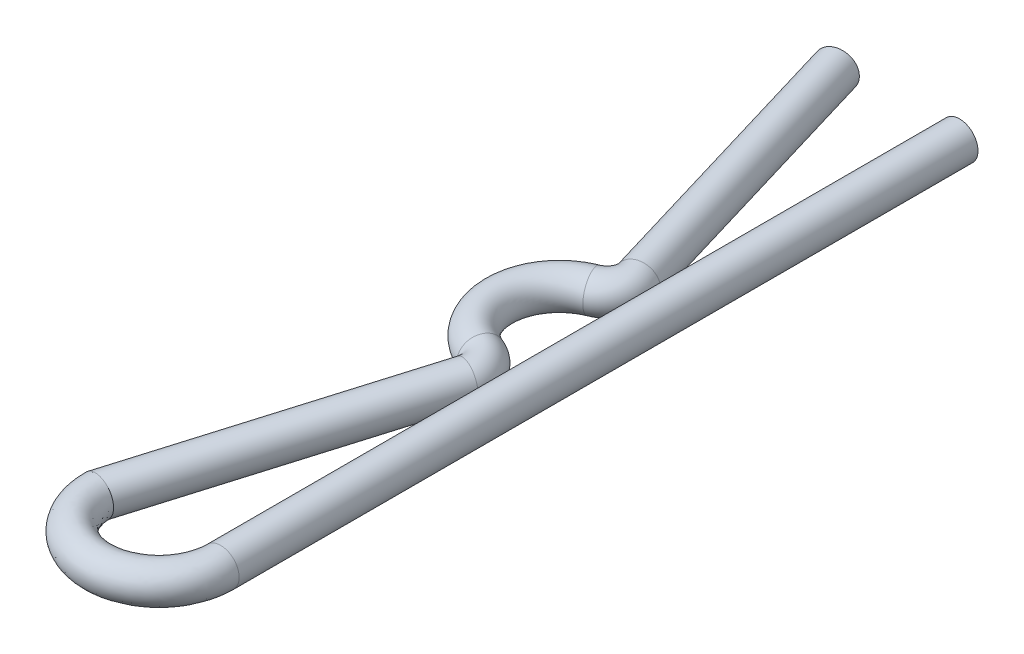
ISO-10303-21;
HEADER;
FILE_DESCRIPTION(('STEP AP214'),'2;1');
FILE_NAME('part.step','',(''),(''),'','','');
FILE_SCHEMA(('AUTOMOTIVE_DESIGN { 1 0 10303 214 1 1 1 1 }'));
ENDSEC;
DATA;
#1=APPLICATION_CONTEXT('core data for automotive mechanical design processes');
#2=APPLICATION_PROTOCOL_DEFINITION('international standard','automotive_design',2000,#1);
#3=PRODUCT_CONTEXT('',#1,'mechanical');
#4=PRODUCT('Part','Part','',(#3));
#5=PRODUCT_RELATED_PRODUCT_CATEGORY('part','',(#4));
#6=PRODUCT_DEFINITION_FORMATION('','',#4);
#7=PRODUCT_DEFINITION_CONTEXT('part definition',#1,'design');
#8=PRODUCT_DEFINITION('design','',#6,#7);
#9=PRODUCT_DEFINITION_SHAPE('','',#8);
#10=(LENGTH_UNIT() NAMED_UNIT(*) SI_UNIT(.MILLI.,.METRE.));
#11=(NAMED_UNIT(*) PLANE_ANGLE_UNIT() SI_UNIT($,.RADIAN.));
#12=(NAMED_UNIT(*) SI_UNIT($,.STERADIAN.) SOLID_ANGLE_UNIT());
#13=UNCERTAINTY_MEASURE_WITH_UNIT(LENGTH_MEASURE(1.E-05),#10,'distance_accuracy_value','');
#14=(GEOMETRIC_REPRESENTATION_CONTEXT(3) GLOBAL_UNCERTAINTY_ASSIGNED_CONTEXT((#13)) GLOBAL_UNIT_ASSIGNED_CONTEXT((#10,
#11,#12)) REPRESENTATION_CONTEXT('',''));
#15=CARTESIAN_POINT('',(0.,0.,0.));
#16=DIRECTION('',(0.,0.,1.));
#17=DIRECTION('',(1.,0.,0.));
#18=AXIS2_PLACEMENT_3D('',#15,#16,#17);
#19=CARTESIAN_POINT('',(-152.5,5.,-200.));
#20=DIRECTION('',(-0.286297081211299,0.,-0.958140898453819));
#21=DIRECTION('',(-0.958140898453819,0.,0.286297081211299));
#22=AXIS2_PLACEMENT_3D('',#19,#20,#21);
#23=PLANE('',#22);
#24=CARTESIAN_POINT('',(-152.5,5.,-200.));
#25=DIRECTION('',(-0.286297081211299,0.,-0.958140898453819));
#26=DIRECTION('',(-0.958140898453819,0.,0.286297081211299));
#27=AXIS2_PLACEMENT_3D('',#24,#25,#26);
#28=CIRCLE('',#27,0.750000000000012);
#29=CARTESIAN_POINT('',(-153.21860567384,5.,-199.785277189091));
#30=VERTEX_POINT('',#29);
#31=EDGE_CURVE('E42',#30,#30,#28,.T.);
#32=ORIENTED_EDGE('',*,*,#31,.T.);
#33=EDGE_LOOP('',(#32));
#34=FACE_BOUND('',#33,.T.);
#35=ADVANCED_FACE('F39',(#34),#23,.T.);
#36=CARTESIAN_POINT('',(-147.5,5.,-200.));
#37=DIRECTION('',(0.,0.,1.));
#38=DIRECTION('',(1.,0.,0.));
#39=AXIS2_PLACEMENT_3D('',#36,#37,#38);
#40=PLANE('',#39);
#41=CARTESIAN_POINT('',(-147.5,5.,-200.));
#42=DIRECTION('',(0.,0.,1.));
#43=DIRECTION('',(1.,0.,0.));
#44=AXIS2_PLACEMENT_3D('',#41,#42,#43);
#45=CIRCLE('',#44,0.750000000000012);
#46=CARTESIAN_POINT('',(-146.75,5.,-200.));
#47=VERTEX_POINT('',#46);
#48=EDGE_CURVE('E62',#47,#47,#45,.T.);
#49=ORIENTED_EDGE('',*,*,#48,.F.);
#50=EDGE_LOOP('',(#49));
#51=FACE_BOUND('',#50,.T.);
#52=ADVANCED_FACE('F87',(#51),#40,.F.);
#53=CARTESIAN_POINT('',(-150.020093319936,5.,-181.792296310652));
#54=DIRECTION('',(0.,1.,0.));
#55=DIRECTION('',(0.,0.,1.));
#56=AXIS2_PLACEMENT_3D('',#53,#54,#55);
#57=TOROIDAL_SURFACE('',#56,1.00000000000004,0.750000000000012);
#58=CARTESIAN_POINT('',(-149.061952421482,5.,-181.505999229441));
#59=DIRECTION('',(0.286297081211301,0.,-0.958140898453818));
#60=DIRECTION('',(-0.958140898453818,0.,-0.286297081211301));
#61=AXIS2_PLACEMENT_3D('',#58,#59,#60);
#62=CIRCLE('',#61,0.750000000000012);
#63=CARTESIAN_POINT('',(-148.343346747641,5.,-181.291276418532));
#64=VERTEX_POINT('',#63);
#65=EDGE_CURVE('E134',#64,#64,#62,.T.);
#66=CARTESIAN_POINT('',(-149.65195032865,5.,-182.72206549597));
#67=DIRECTION('',(-0.929769185318183,0.,-0.368142991285673));
#68=DIRECTION('',(-0.368142991285673,0.,0.929769185318183));
#69=AXIS2_PLACEMENT_3D('',#66,#67,#68);
#70=CIRCLE('',#69,0.750000000000012);
#71=CARTESIAN_POINT('',(-149.375843085186,5.,-183.419392384959));
#72=VERTEX_POINT('',#71);
#73=EDGE_CURVE('E130',#72,#72,#70,.T.);
#74=CARTESIAN_POINT('',(-150.020093319936,5.,-181.792296310652));
#75=DIRECTION('',(0.,1.,0.));
#76=DIRECTION('',(0.,0.,1.));
#77=AXIS2_PLACEMENT_3D('',#74,#75,#76);
#78=CIRCLE('',#77,1.75000000000005);
#79=EDGE_CURVE('',#64,#72,#78,.T.);
#80=ORIENTED_EDGE('',*,*,#65,.T.);
#81=ORIENTED_EDGE('',*,*,#73,.F.);
#82=ORIENTED_EDGE('',*,*,#79,.T.);
#83=ORIENTED_EDGE('',*,*,#79,.F.);
#84=EDGE_LOOP('',(#80,#82,#81,#83));
#85=FACE_BOUND('',#84,.T.);
#86=ADVANCED_FACE('F82',(#85),#57,.T.);
#87=CARTESIAN_POINT('',(-148.75,5.,-185.));
#88=DIRECTION('',(0.,-1.,0.));
#89=DIRECTION('',(0.,0.,-1.));
#90=AXIS2_PLACEMENT_3D('',#87,#88,#89);
#91=TOROIDAL_SURFACE('',#90,2.44999999999997,0.750000000000012);
#92=CARTESIAN_POINT('',(-149.65195032865,5.,-187.27793450403));
#93=DIRECTION('',(0.929769185318179,0.,-0.368142991285682));
#94=DIRECTION('',(-0.368142991285682,0.,-0.929769185318179));
#95=AXIS2_PLACEMENT_3D('',#92,#93,#94);
#96=CIRCLE('',#95,0.750000000000012);
#97=CARTESIAN_POINT('',(-149.375843085186,5.,-186.580607615041));
#98=VERTEX_POINT('',#97);
#99=EDGE_CURVE('E126',#98,#98,#96,.T.);
#100=ORIENTED_EDGE('',*,*,#99,.F.);
#101=EDGE_LOOP('',(#100));
#102=FACE_BOUND('',#101,.T.);
#103=ORIENTED_EDGE('',*,*,#73,.T.);
#104=EDGE_LOOP('',(#103));
#105=FACE_BOUND('',#104,.T.);
#106=ADVANCED_FACE('F86',(#102,#105),#91,.T.);
#107=CARTESIAN_POINT('',(-150.020093319936,5.,-188.207703689348));
#108=DIRECTION('',(0.,1.,0.));
#109=DIRECTION('',(0.,0.,1.));
#110=AXIS2_PLACEMENT_3D('',#107,#108,#109);
#111=TOROIDAL_SURFACE('',#110,0.99999999999999,0.750000000000012);
#112=CARTESIAN_POINT('',(-149.061952421482,5.,-188.494000770559));
#113=DIRECTION('',(-0.286297081211309,0.,-0.958140898453816));
#114=DIRECTION('',(-0.958140898453816,0.,0.286297081211309));
#115=AXIS2_PLACEMENT_3D('',#112,#113,#114);
#116=CIRCLE('',#115,0.750000000000012);
#117=CARTESIAN_POINT('',(-148.343346747641,5.,-188.708723581467));
#118=VERTEX_POINT('',#117);
#119=EDGE_CURVE('E123',#118,#118,#116,.T.);
#120=CARTESIAN_POINT('',(-150.020093319936,5.,-188.207703689348));
#121=DIRECTION('',(0.,1.,0.));
#122=DIRECTION('',(0.,0.,1.));
#123=AXIS2_PLACEMENT_3D('',#120,#121,#122);
#124=CIRCLE('',#123,1.75);
#125=EDGE_CURVE('',#98,#118,#124,.T.);
#126=ORIENTED_EDGE('',*,*,#99,.T.);
#127=ORIENTED_EDGE('',*,*,#119,.F.);
#128=ORIENTED_EDGE('',*,*,#125,.T.);
#129=ORIENTED_EDGE('',*,*,#125,.F.);
#130=EDGE_LOOP('',(#126,#128,#127,#129));
#131=FACE_BOUND('',#130,.T.);
#132=ADVANCED_FACE('F91',(#131),#111,.T.);
#133=CARTESIAN_POINT('',(-149.061952421482,5.,-188.494000770559));
#134=DIRECTION('',(-0.286297081211299,0.,-0.958140898453819));
#135=DIRECTION('',(-0.958140898453819,0.,0.286297081211299));
#136=AXIS2_PLACEMENT_3D('',#133,#134,#135);
#137=CYLINDRICAL_SURFACE('',#136,0.750000000000012);
#138=ORIENTED_EDGE('',*,*,#31,.F.);
#139=EDGE_LOOP('',(#138));
#140=FACE_BOUND('',#139,.T.);
#141=ORIENTED_EDGE('',*,*,#119,.T.);
#142=EDGE_LOOP('',(#141));
#143=FACE_BOUND('',#142,.T.);
#144=ADVANCED_FACE('F95',(#140,#143),#137,.T.);
#145=CARTESIAN_POINT('',(-152.563163466897,5.,-169.788612930786));
#146=DIRECTION('',(0.286297081211301,0.,-0.958140898453818));
#147=DIRECTION('',(-0.958140898453818,0.,-0.286297081211301));
#148=AXIS2_PLACEMENT_3D('',#145,#146,#147);
#149=CYLINDRICAL_SURFACE('',#148,0.750000000000012);
#150=CARTESIAN_POINT('',(-152.5,5.75000000000001,-170.));
#151=CARTESIAN_POINT('',(-152.503375330648,5.75000011260235,-170.000493330124));
#152=CARTESIAN_POINT('',(-152.506751182232,5.7499773120419,-170.00098673835));
#153=CARTESIAN_POINT('',(-152.552521718769,5.7493579131014,-170.007676501503));
#154=CARTESIAN_POINT('',(-152.594943296979,5.74517524825669,-170.013877089442));
#155=CARTESIAN_POINT('',(-152.678569825528,5.72967812627067,-170.026100925214));
#156=CARTESIAN_POINT('',(-152.719771185352,5.71834446165278,-170.032123649557));
#157=CARTESIAN_POINT('',(-152.799666852359,5.6888477693917,-170.043803020842));
#158=CARTESIAN_POINT('',(-152.838363901874,5.67069236544348,-170.049460068208));
#159=CARTESIAN_POINT('',(-152.912169856392,5.62804148290476,-170.060249932538));
#160=CARTESIAN_POINT('',(-152.947278809077,5.60354608858256,-170.065382756468));
#161=CARTESIAN_POINT('',(-153.01271242388,5.54903004852626,-170.074949185807));
#162=CARTESIAN_POINT('',(-153.043060457423,5.51903806834385,-170.07938620688));
#163=CARTESIAN_POINT('',(-153.098285032627,5.45428033072372,-170.087460443309));
#164=CARTESIAN_POINT('',(-153.123161162324,5.41951421417569,-170.091097598447));
#165=CARTESIAN_POINT('',(-153.166460982495,5.34657674917339,-170.09742857765));
#166=CARTESIAN_POINT('',(-153.184947750324,5.30844364777722,-170.10013162344));
#167=CARTESIAN_POINT('',(-153.215256133025,5.22956264771869,-170.104563203915));
#168=CARTESIAN_POINT('',(-153.227078258191,5.18881494951503,-170.10629181321));
#169=CARTESIAN_POINT('',(-153.243618993026,5.10626470060105,-170.108710376375));
#170=CARTESIAN_POINT('',(-153.248402086906,5.06447533815727,-170.109409758938));
#171=CARTESIAN_POINT('',(-153.250925554966,4.98068055323597,-170.109778739158));
#172=CARTESIAN_POINT('',(-153.24866614974,4.93867513756704,-170.109448369072));
#173=CARTESIAN_POINT('',(-153.237198376062,4.85582791680656,-170.107771561805));
#174=CARTESIAN_POINT('',(-153.228019560298,4.8149819275491,-170.106429445776));
#175=CARTESIAN_POINT('',(-153.203023518739,4.73542084718833,-170.102774591182));
#176=CARTESIAN_POINT('',(-153.187206212417,4.69670578194008,-170.100461840842));
#177=CARTESIAN_POINT('',(-153.149353342886,4.62239070520035,-170.094927213689));
#178=CARTESIAN_POINT('',(-153.127301823859,4.58679899797424,-170.091703004091));
#179=CARTESIAN_POINT('',(-153.077646085696,4.51982549761284,-170.084442858151));
#180=CARTESIAN_POINT('',(-153.050042019476,4.48844358857946,-170.080406944163));
#181=CARTESIAN_POINT('',(-152.989503844714,4.43018624832734,-170.071556047467));
#182=CARTESIAN_POINT('',(-152.956478673881,4.40340744520117,-170.066727754999));
#183=CARTESIAN_POINT('',(-152.886448150136,4.35583196489853,-170.056489573118));
#184=CARTESIAN_POINT('',(-152.849442559585,4.33503564516152,-170.05107964898));
#185=CARTESIAN_POINT('',(-152.772490065953,4.29997070160093,-170.0398301875));
#186=CARTESIAN_POINT('',(-152.732540860012,4.2857072529133,-170.033990313801));
#187=CARTESIAN_POINT('',(-152.650915979252,4.2641326437279,-170.022058648033));
#188=CARTESIAN_POINT('',(-152.609244224016,4.25680651823822,-170.015967427941));
#189=CARTESIAN_POINT('',(-152.548283577589,4.25131135329889,-170.007057121793));
#190=CARTESIAN_POINT('',(-152.529209253263,4.25032595275375,-170.004269181337));
#191=CARTESIAN_POINT('',(-152.506751623757,4.25002280954366,-170.000986802892));
#192=CARTESIAN_POINT('',(-152.503375800376,4.2500000201725,-170.000493398785));
#193=CARTESIAN_POINT('',(-152.5,4.24999999999999,-170.));
#194=B_SPLINE_CURVE_WITH_KNOTS('',3,(#150,#151,#152,#153,#154,#155,#156,#157,#158,#159,#160,
#161,#162,#163,#164,#165,#166,#167,#168,#169,#170,#171,#172,#173,#174,#175,#176,#177,#178,#179,
#180,#181,#182,#183,#184,#185,#186,#187,#188,#189,#190,#191,#192,#193),.UNSPECIFIED.,.F.,.F.,(4,
2,2,2,2,2,2,2,2,2,2,2,2,2,2,2,2,2,2,2,2,4),(0.,0.0102350319558408,0.138761754328585,
0.267635175763977,0.396364999878873,0.525093113062595,0.653168064695325,0.781252655402597,
0.908034002040272,1.03480564005793,1.16040853974329,1.286007505205,1.41107305749056,
1.53614012689557,1.66153023619956,1.78691689273537,1.91467876819877,2.04244827555212,
2.17031882359132,2.29791290036853,2.35577118588024,2.36600621783616),.UNSPECIFIED.);
#195=CARTESIAN_POINT('',(-152.5,5.75000000000001,-170.));
#196=VERTEX_POINT('',#195);
#197=CARTESIAN_POINT('',(-152.5,4.24999999999999,-170.));
#198=VERTEX_POINT('',#197);
#199=EDGE_CURVE('E11',#196,#198,#194,.T.);
#200=ORIENTED_EDGE('',*,*,#199,.F.);
#201=CARTESIAN_POINT('',(-152.5,5.75000000000001,-170.));
#202=CARTESIAN_POINT('',(-152.496624668512,5.75000011249518,-169.999506667558));
#203=CARTESIAN_POINT('',(-152.493248744198,5.74997731198361,-169.999013758482));
#204=CARTESIAN_POINT('',(-152.44739213498,5.74935681573075,-169.992325244979));
#205=CARTESIAN_POINT('',(-152.404873115549,5.74515918546722,-169.986203720871));
#206=CARTESIAN_POINT('',(-152.32103537906,5.72961603019825,-169.974282986299));
#207=CARTESIAN_POINT('',(-152.279720231482,5.71825114333282,-169.968484695354));
#208=CARTESIAN_POINT('',(-152.199587235641,5.68868665006071,-169.957381196812));
#209=CARTESIAN_POINT('',(-152.160766432144,5.67049531310356,-169.952075402275));
#210=CARTESIAN_POINT('',(-152.08669945629,5.62777137405202,-169.94208753473));
#211=CARTESIAN_POINT('',(-152.051453262761,5.60323880951929,-169.937405458029));
#212=CARTESIAN_POINT('',(-151.985690264028,5.54860715761486,-169.928791956661));
#213=CARTESIAN_POINT('',(-151.955156585289,5.51852881876622,-169.92485784154));
#214=CARTESIAN_POINT('',(-151.899580594929,5.45357681246055,-169.917796940958));
#215=CARTESIAN_POINT('',(-151.874538701311,5.41870278031227,-169.914670216948));
#216=CARTESIAN_POINT('',(-151.830971834439,5.34555637681782,-169.909298130581));
#217=CARTESIAN_POINT('',(-151.812378365314,5.30732549515586,-169.907043473396));
#218=CARTESIAN_POINT('',(-151.78192070395,5.22823400968775,-169.903383235674));
#219=CARTESIAN_POINT('',(-151.7700557896,5.18737368859893,-169.901977564021));
#220=CARTESIAN_POINT('',(-151.753550150182,5.1047573975312,-169.900029731008));
#221=CARTESIAN_POINT('',(-151.748816787621,5.06302018304611,-169.899476494495));
#222=CARTESIAN_POINT('',(-151.746433132869,4.97934226513357,-169.899197334209));
#223=CARTESIAN_POINT('',(-151.748782470795,4.93740157244661,-169.899471367233));
#224=CARTESIAN_POINT('',(-151.760444563061,4.85482311925906,-169.90084238043));
#225=CARTESIAN_POINT('',(-151.769707222966,4.81417816825361,-169.901933440552));
#226=CARTESIAN_POINT('',(-151.794843958298,4.73501923317368,-169.904931763741));
#227=CARTESIAN_POINT('',(-151.810718249978,4.6965053188481,-169.906839053505));
#228=CARTESIAN_POINT('',(-151.848675844746,4.62250237045656,-169.911471667751));
#229=CARTESIAN_POINT('',(-151.870787103335,4.58702791537399,-169.914200679181));
#230=CARTESIAN_POINT('',(-151.920522934797,4.52026620756039,-169.920443724083));
#231=CARTESIAN_POINT('',(-151.948147262726,4.48897876890474,-169.92395772268));
#232=CARTESIAN_POINT('',(-152.008484552521,4.43105982883765,-169.931760209947));
#233=CARTESIAN_POINT('',(-152.041256322111,4.40449081775721,-169.936057755142));
#234=CARTESIAN_POINT('',(-152.110695949221,4.35719875646855,-169.945304719747));
#235=CARTESIAN_POINT('',(-152.147364098772,4.3364761448689,-169.950254188026));
#236=CARTESIAN_POINT('',(-152.224321680237,4.30107485967638,-169.960788262599));
#237=CARTESIAN_POINT('',(-152.264668604983,4.28652450887457,-169.966383538024));
#238=CARTESIAN_POINT('',(-152.347121430249,4.26449632092791,-169.977971126385));
#239=CARTESIAN_POINT('',(-152.389223358929,4.25700333230107,-169.983962559055));
#240=CARTESIAN_POINT('',(-152.450981451229,4.25134924758042,-169.99286548671));
#241=CARTESIAN_POINT('',(-152.470424271111,4.25033086884783,-169.995684633315));
#242=CARTESIAN_POINT('',(-152.493248307772,4.25002280888505,-169.999013697165));
#243=CARTESIAN_POINT('',(-152.496624204605,4.25000001935859,-169.999506602418));
#244=CARTESIAN_POINT('',(-152.5,4.24999999999999,-170.));
#245=B_SPLINE_CURVE_WITH_KNOTS('',3,(#201,#202,#203,#204,#205,#206,#207,#208,#209,#210,#211,
#212,#213,#214,#215,#216,#217,#218,#219,#220,#221,#222,#223,#224,#225,#226,#227,#228,#229,#230,
#231,#232,#233,#234,#235,#236,#237,#238,#239,#240,#241,#242,#243,#244),.UNSPECIFIED.,.F.,.F.,(4,
2,2,2,2,2,2,2,2,2,2,2,2,2,2,2,2,2,2,2,2,4),(0.,0.0102350320472458,0.139016739192064,
0.268147840464776,0.397123016778924,0.526097429138406,0.654598753238531,0.783109854705218,
0.910210784100738,1.03729807036389,1.16271983756593,1.28813505495793,1.41265022145859,
1.53716946093632,1.66225594331941,1.78733686938865,1.91396755430701,2.04060773678749,
2.16976514677236,2.29864463181136,2.35761082075561,2.36784585280262),.UNSPECIFIED.);
#246=EDGE_CURVE('E47',#196,#198,#245,.T.);
#247=ORIENTED_EDGE('',*,*,#246,.T.);
#248=EDGE_LOOP('',(#200,#247));
#249=FACE_BOUND('',#248,.T.);
#250=ORIENTED_EDGE('',*,*,#65,.F.);
#251=EDGE_LOOP('',(#250));
#252=FACE_BOUND('',#251,.T.);
#253=ADVANCED_FACE('F54',(#249,#252),#149,.T.);
#254=CARTESIAN_POINT('',(-147.5,5.,-200.));
#255=DIRECTION('',(0.,0.,1.));
#256=DIRECTION('',(1.,0.,0.));
#257=AXIS2_PLACEMENT_3D('',#254,#255,#256);
#258=CYLINDRICAL_SURFACE('',#257,0.750000000000012);
#259=CARTESIAN_POINT('',(-147.5,5.,-170.));
#260=DIRECTION('',(0.,0.,1.));
#261=DIRECTION('',(1.,0.,0.));
#262=AXIS2_PLACEMENT_3D('',#259,#260,#261);
#263=CIRCLE('',#262,0.750000000000012);
#264=CARTESIAN_POINT('',(-146.75,5.,-170.));
#265=VERTEX_POINT('',#264);
#266=EDGE_CURVE('E59',#265,#265,#263,.T.);
#267=ORIENTED_EDGE('',*,*,#266,.F.);
#268=EDGE_LOOP('',(#267));
#269=FACE_BOUND('',#268,.T.);
#270=ORIENTED_EDGE('',*,*,#48,.T.);
#271=EDGE_LOOP('',(#270));
#272=FACE_BOUND('',#271,.T.);
#273=ADVANCED_FACE('F101',(#269,#272),#258,.T.);
#274=CARTESIAN_POINT('',(-146.75,5.,-170.));
#275=CARTESIAN_POINT('',(-146.75,5.,-169.149151989653));
#276=CARTESIAN_POINT('',(-147.100264462369,5.,-168.3035414599));
#277=CARTESIAN_POINT('',(-148.303541459918,5.,-167.100264462387));
#278=CARTESIAN_POINT('',(-149.149154675414,5.,-166.75));
#279=CARTESIAN_POINT('',(-150.850845324586,5.,-166.75));
#280=CARTESIAN_POINT('',(-151.696458844244,5.,-167.10026476674));
#281=CARTESIAN_POINT('',(-152.598916136162,5.,-168.002722058345));
#282=CARTESIAN_POINT('',(-152.839383478402,5.,-168.362502573422));
#283=CARTESIAN_POINT('',(-153.083745148173,5.,-168.952018630647));
#284=CARTESIAN_POINT('',(-153.145857460161,5.,-169.156581375413));
#285=CARTESIAN_POINT('',(-153.208191909282,5.,-169.469600898367));
#286=CARTESIAN_POINT('',(-153.22384569686,5.,-169.574969801744));
#287=CARTESIAN_POINT('',(-153.244748930811,5.,-169.786842496355));
#288=CARTESIAN_POINT('',(-153.249989334654,5.,-169.905651906072));
#289=CARTESIAN_POINT('',(-153.250009560178,5.,-170.084571523821));
#290=CARTESIAN_POINT('',(-153.25,5.,-170.147081408424));
#291=CARTESIAN_POINT('',(-153.25,5.,-170.22062211263));
#292=CARTESIAN_POINT('',(-146.75,6.50000000000002,-170.));
#293=CARTESIAN_POINT('',(-146.75,6.50000000000002,-169.149151989653));
#294=CARTESIAN_POINT('',(-147.100264462369,6.50000000000002,-168.3035414599));
#295=CARTESIAN_POINT('',(-148.303541459918,6.50000000000002,-167.100264462387));
#296=CARTESIAN_POINT('',(-149.149154675414,6.50000000000002,-166.75));
#297=CARTESIAN_POINT('',(-150.850845324586,6.50000000000002,-166.75));
#298=CARTESIAN_POINT('',(-151.696458844244,6.50000000000002,-167.10026476674));
#299=CARTESIAN_POINT('',(-152.598916136162,6.50000000000002,-168.002722058345));
#300=CARTESIAN_POINT('',(-152.839383478402,6.50000000000002,-168.362502573422));
#301=CARTESIAN_POINT('',(-153.083745148173,6.50000000000002,-168.952018630647));
#302=CARTESIAN_POINT('',(-153.145857460161,6.50000000000002,-169.156581375413));
#303=CARTESIAN_POINT('',(-153.208191909282,6.50000000000002,-169.469600898367));
#304=CARTESIAN_POINT('',(-153.22384569686,6.50000000000002,-169.574969801744));
#305=CARTESIAN_POINT('',(-153.244748930811,6.50000000000002,-169.786842496355));
#306=CARTESIAN_POINT('',(-153.249989334654,6.50000000000002,-169.905651906072));
#307=CARTESIAN_POINT('',(-153.250009560178,6.50000000000002,-170.084571523821));
#308=CARTESIAN_POINT('',(-153.25,6.50000000000002,-170.147081408424));
#309=CARTESIAN_POINT('',(-153.25,6.50000000000002,-170.22062211263));
#310=CARTESIAN_POINT('',(-148.25,6.50000000000002,-170.));
#311=CARTESIAN_POINT('',(-148.25,6.50000000000002,-169.541851071352));
#312=CARTESIAN_POINT('',(-148.438603941265,6.50000000000002,-169.086522324564));
#313=CARTESIAN_POINT('',(-149.086522324582,6.50000000000002,-168.438603941283));
#314=CARTESIAN_POINT('',(-149.541852517541,6.50000000000002,-168.25));
#315=CARTESIAN_POINT('',(-150.458147482459,6.50000000000002,-168.25));
#316=CARTESIAN_POINT('',(-150.913477839212,6.50000000000002,-168.438604105159));
#317=CARTESIAN_POINT('',(-151.399416381009,6.50000000000002,-168.924542646806));
#318=CARTESIAN_POINT('',(-151.52889879606,6.50000000000002,-169.11827061646));
#319=CARTESIAN_POINT('',(-151.66047815671,6.50000000000002,-169.435702339578));
#320=CARTESIAN_POINT('',(-151.693923247778,6.50000000000002,-169.545851509839));
#321=CARTESIAN_POINT('',(-151.727487951152,6.50000000000002,-169.714400483736));
#322=CARTESIAN_POINT('',(-151.735916913695,6.50000000000002,-169.771137585555));
#323=CARTESIAN_POINT('',(-151.747172501205,6.50000000000002,-169.885222882652));
#324=CARTESIAN_POINT('',(-151.749994257121,6.50000000000002,-169.930264388284));
#325=CARTESIAN_POINT('',(-151.750005147788,6.50000000000002,-170.062509444567));
#326=CARTESIAN_POINT('',(-151.75,6.50000000000002,-170.147081408424));
#327=CARTESIAN_POINT('',(-151.75,6.50000000000002,-170.22062211263));
#328=CARTESIAN_POINT('',(-148.25,5.,-170.));
#329=CARTESIAN_POINT('',(-148.25,5.,-169.541851071352));
#330=CARTESIAN_POINT('',(-148.438603941265,5.,-169.086522324564));
#331=CARTESIAN_POINT('',(-149.086522324582,5.,-168.438603941283));
#332=CARTESIAN_POINT('',(-149.541852517541,5.,-168.25));
#333=CARTESIAN_POINT('',(-150.458147482459,5.,-168.25));
#334=CARTESIAN_POINT('',(-150.913477839212,5.,-168.438604105159));
#335=CARTESIAN_POINT('',(-151.399416381009,5.,-168.924542646806));
#336=CARTESIAN_POINT('',(-151.52889879606,5.,-169.11827061646));
#337=CARTESIAN_POINT('',(-151.66047815671,5.,-169.435702339578));
#338=CARTESIAN_POINT('',(-151.693923247778,5.,-169.545851509839));
#339=CARTESIAN_POINT('',(-151.727487951152,5.,-169.714400483736));
#340=CARTESIAN_POINT('',(-151.735916913695,5.,-169.771137585555));
#341=CARTESIAN_POINT('',(-151.747172501205,5.,-169.885222882652));
#342=CARTESIAN_POINT('',(-151.749994257121,5.,-169.930264388284));
#343=CARTESIAN_POINT('',(-151.750005147788,5.,-170.062509444567));
#344=CARTESIAN_POINT('',(-151.75,5.,-170.147081408424));
#345=CARTESIAN_POINT('',(-151.75,5.,-170.22062211263));
#346=CARTESIAN_POINT('',(-148.25,3.49999999999998,-170.));
#347=CARTESIAN_POINT('',(-148.25,3.49999999999998,-169.541851071352));
#348=CARTESIAN_POINT('',(-148.438603941265,3.49999999999998,-169.086522324564));
#349=CARTESIAN_POINT('',(-149.086522324582,3.49999999999998,-168.438603941283));
#350=CARTESIAN_POINT('',(-149.541852517541,3.49999999999998,-168.25));
#351=CARTESIAN_POINT('',(-150.458147482459,3.49999999999998,-168.25));
#352=CARTESIAN_POINT('',(-150.913477839212,3.49999999999998,-168.438604105159));
#353=CARTESIAN_POINT('',(-151.399416381009,3.49999999999998,-168.924542646806));
#354=CARTESIAN_POINT('',(-151.52889879606,3.49999999999998,-169.11827061646));
#355=CARTESIAN_POINT('',(-151.66047815671,3.49999999999998,-169.435702339578));
#356=CARTESIAN_POINT('',(-151.693923247778,3.49999999999998,-169.545851509839));
#357=CARTESIAN_POINT('',(-151.727487951152,3.49999999999998,-169.714400483736));
#358=CARTESIAN_POINT('',(-151.735916913695,3.49999999999998,-169.771137585555));
#359=CARTESIAN_POINT('',(-151.747172501205,3.49999999999998,-169.885222882652));
#360=CARTESIAN_POINT('',(-151.749994257121,3.49999999999998,-169.930264388284));
#361=CARTESIAN_POINT('',(-151.750005147788,3.49999999999998,-170.062509444567));
#362=CARTESIAN_POINT('',(-151.75,3.49999999999998,-170.147081408424));
#363=CARTESIAN_POINT('',(-151.75,3.49999999999998,-170.22062211263));
#364=CARTESIAN_POINT('',(-146.75,3.49999999999998,-170.));
#365=CARTESIAN_POINT('',(-146.75,3.49999999999998,-169.149151989653));
#366=CARTESIAN_POINT('',(-147.100264462369,3.49999999999998,-168.3035414599));
#367=CARTESIAN_POINT('',(-148.303541459918,3.49999999999998,-167.100264462387));
#368=CARTESIAN_POINT('',(-149.149154675414,3.49999999999998,-166.75));
#369=CARTESIAN_POINT('',(-150.850845324586,3.49999999999998,-166.75));
#370=CARTESIAN_POINT('',(-151.696458844244,3.49999999999998,-167.10026476674));
#371=CARTESIAN_POINT('',(-152.598916136162,3.49999999999998,-168.002722058345));
#372=CARTESIAN_POINT('',(-152.839383478402,3.49999999999998,-168.362502573422));
#373=CARTESIAN_POINT('',(-153.083745148173,3.49999999999998,-168.952018630647));
#374=CARTESIAN_POINT('',(-153.145857460161,3.49999999999998,-169.156581375413));
#375=CARTESIAN_POINT('',(-153.208191909282,3.49999999999998,-169.469600898367));
#376=CARTESIAN_POINT('',(-153.22384569686,3.49999999999998,-169.574969801744));
#377=CARTESIAN_POINT('',(-153.244748930811,3.49999999999998,-169.786842496355));
#378=CARTESIAN_POINT('',(-153.249989334654,3.49999999999998,-169.905651906072));
#379=CARTESIAN_POINT('',(-153.250009560178,3.49999999999998,-170.084571523821));
#380=CARTESIAN_POINT('',(-153.25,3.49999999999998,-170.147081408424));
#381=CARTESIAN_POINT('',(-153.25,3.49999999999998,-170.22062211263));
#382=CARTESIAN_POINT('',(-146.75,5.,-170.));
#383=CARTESIAN_POINT('',(-146.75,5.,-169.149151989653));
#384=CARTESIAN_POINT('',(-147.100264462369,5.,-168.3035414599));
#385=CARTESIAN_POINT('',(-148.303541459918,5.,-167.100264462387));
#386=CARTESIAN_POINT('',(-149.149154675414,5.,-166.75));
#387=CARTESIAN_POINT('',(-150.850845324586,5.,-166.75));
#388=CARTESIAN_POINT('',(-151.696458844244,5.,-167.10026476674));
#389=CARTESIAN_POINT('',(-152.598916136162,5.,-168.002722058345));
#390=CARTESIAN_POINT('',(-152.839383478402,5.,-168.362502573422));
#391=CARTESIAN_POINT('',(-153.083745148173,5.,-168.952018630647));
#392=CARTESIAN_POINT('',(-153.145857460161,5.,-169.156581375413));
#393=CARTESIAN_POINT('',(-153.208191909282,5.,-169.469600898367));
#394=CARTESIAN_POINT('',(-153.22384569686,5.,-169.574969801744));
#395=CARTESIAN_POINT('',(-153.244748930811,5.,-169.786842496355));
#396=CARTESIAN_POINT('',(-153.249989334654,5.,-169.905651906072));
#397=CARTESIAN_POINT('',(-153.250009560178,5.,-170.084571523821));
#398=CARTESIAN_POINT('',(-153.25,5.,-170.147081408424));
#399=CARTESIAN_POINT('',(-153.25,5.,-170.22062211263));
#400=(BOUNDED_SURFACE() B_SPLINE_SURFACE(3,3,((#274,#275,#276,#277,#278,#279,#280,#281,#282,
#283,#284,#285,#286,#287,#288,#289,#290,#291),(#292,#293,#294,#295,#296,#297,#298,#299,#300,
#301,#302,#303,#304,#305,#306,#307,#308,#309),(#310,#311,#312,#313,#314,#315,#316,#317,#318,
#319,#320,#321,#322,#323,#324,#325,#326,#327),(#328,#329,#330,#331,#332,#333,#334,#335,#336,
#337,#338,#339,#340,#341,#342,#343,#344,#345),(#346,#347,#348,#349,#350,#351,#352,#353,#354,
#355,#356,#357,#358,#359,#360,#361,#362,#363),(#364,#365,#366,#367,#368,#369,#370,#371,#372,
#373,#374,#375,#376,#377,#378,#379,#380,#381),(#382,#383,#384,#385,#386,#387,#388,#389,#390,
#391,#392,#393,#394,#395,#396,#397,#398,#399)),.UNSPECIFIED.,.T.,.F.,
.F.) B_SPLINE_SURFACE_WITH_KNOTS((4,3,4),(4,2,2,2,2,2,2,2,4),(0.,0.5,1.),(0.792519008702498,
0.844389256526873,0.896259504351249,0.948129752175624,0.974064876087812,0.987032438043906,
0.993516219021953,1.,1.00581191643206),
.UNSPECIFIED.) GEOMETRIC_REPRESENTATION_ITEM() RATIONAL_B_SPLINE_SURFACE(((1.,1.,1.,1.,1.,1.,1.,
1.,1.,1.,1.,1.,1.,1.,1.,1.,1.,1.),(0.333333333333333,0.333333333333333,0.333333333333333,
0.333333333333333,0.333333333333333,0.333333333333333,0.333333333333333,0.333333333333333,
0.333333333333333,0.333333333333333,0.333333333333333,0.333333333333333,0.333333333333333,
0.333333333333333,0.333333333333333,0.333333333333333,0.333333333333333,0.333333333333333),
(0.333333333333333,0.333333333333333,0.333333333333333,0.333333333333333,0.333333333333333,
0.333333333333333,0.333333333333333,0.333333333333333,0.333333333333333,0.333333333333333,
0.333333333333333,0.333333333333333,0.333333333333333,0.333333333333333,0.333333333333333,
0.333333333333333,0.333333333333333,0.333333333333333),(1.,1.,1.,1.,1.,1.,1.,1.,1.,1.,1.,1.,1.,
1.,1.,1.,1.,1.),(0.333333333333333,0.333333333333333,0.333333333333333,0.333333333333333,
0.333333333333333,0.333333333333333,0.333333333333333,0.333333333333333,0.333333333333333,
0.333333333333333,0.333333333333333,0.333333333333333,0.333333333333333,0.333333333333333,
0.333333333333333,0.333333333333333,0.333333333333333,0.333333333333333),(0.333333333333333,
0.333333333333333,0.333333333333333,0.333333333333333,0.333333333333333,0.333333333333333,
0.333333333333333,0.333333333333333,0.333333333333333,0.333333333333333,0.333333333333333,
0.333333333333333,0.333333333333333,0.333333333333333,0.333333333333333,0.333333333333333,
0.333333333333333,0.333333333333333),(1.,1.,1.,1.,1.,1.,1.,1.,1.,1.,1.,1.,1.,1.,1.,1.,1.,1.))) REPRESENTATION_ITEM('') SURFACE());
#401=ORIENTED_EDGE('',*,*,#246,.F.);
#402=ORIENTED_EDGE('',*,*,#199,.T.);
#403=EDGE_LOOP('',(#401,#402));
#404=FACE_BOUND('',#403,.T.);
#405=ORIENTED_EDGE('',*,*,#266,.T.);
#406=EDGE_LOOP('',(#405));
#407=FACE_BOUND('',#406,.T.);
#408=ADVANCED_FACE('F57',(#404,#407),#400,.T.);
#409=CLOSED_SHELL('',(#35,#52,#86,#106,#132,#144,#253,#273,#408));
#410=MANIFOLD_SOLID_BREP('B2',#409);
#411=ADVANCED_BREP_SHAPE_REPRESENTATION('',(#18,#410),#14);
#412=SHAPE_DEFINITION_REPRESENTATION(#9,#411);
ENDSEC;
END-ISO-10303-21;
